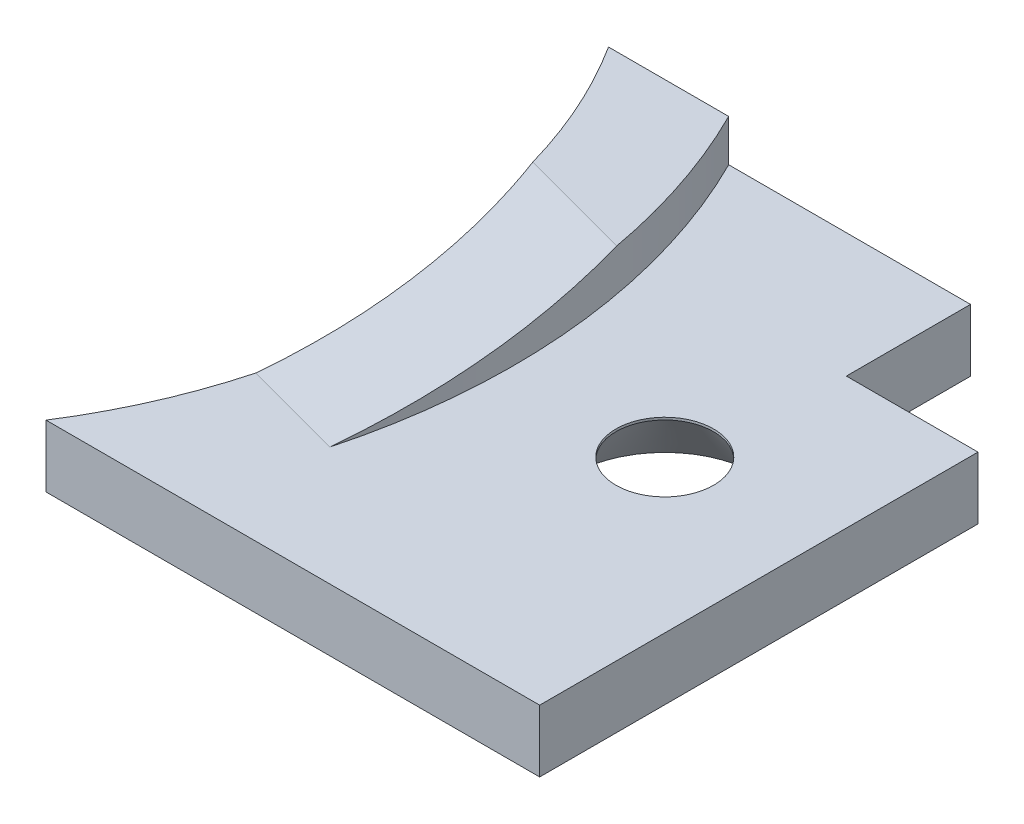
ISO-10303-21;
HEADER;
FILE_DESCRIPTION(('STEP AP214'),'2;1');
FILE_NAME('part.step','',(''),(''),'','','');
FILE_SCHEMA(('AUTOMOTIVE_DESIGN { 1 0 10303 214 1 1 1 1 }'));
ENDSEC;
DATA;
#1=APPLICATION_CONTEXT('core data for automotive mechanical design processes');
#2=APPLICATION_PROTOCOL_DEFINITION('international standard','automotive_design',2000,#1);
#3=PRODUCT_CONTEXT('',#1,'mechanical');
#4=PRODUCT('Part','Part','',(#3));
#5=PRODUCT_RELATED_PRODUCT_CATEGORY('part','',(#4));
#6=PRODUCT_DEFINITION_FORMATION('','',#4);
#7=PRODUCT_DEFINITION_CONTEXT('part definition',#1,'design');
#8=PRODUCT_DEFINITION('design','',#6,#7);
#9=PRODUCT_DEFINITION_SHAPE('','',#8);
#10=(LENGTH_UNIT() NAMED_UNIT(*) SI_UNIT(.MILLI.,.METRE.));
#11=(NAMED_UNIT(*) PLANE_ANGLE_UNIT() SI_UNIT($,.RADIAN.));
#12=(NAMED_UNIT(*) SI_UNIT($,.STERADIAN.) SOLID_ANGLE_UNIT());
#13=UNCERTAINTY_MEASURE_WITH_UNIT(LENGTH_MEASURE(1.E-05),#10,'distance_accuracy_value','');
#14=(GEOMETRIC_REPRESENTATION_CONTEXT(3) GLOBAL_UNCERTAINTY_ASSIGNED_CONTEXT((#13)) GLOBAL_UNIT_ASSIGNED_CONTEXT((#10,
#11,#12)) REPRESENTATION_CONTEXT('',''));
#15=CARTESIAN_POINT('',(0.,0.,0.));
#16=DIRECTION('',(0.,0.,1.));
#17=DIRECTION('',(1.,0.,0.));
#18=AXIS2_PLACEMENT_3D('',#15,#16,#17);
#19=CARTESIAN_POINT('',(-31.2610975201711,2.08,-9.4));
#20=DIRECTION('',(0.,-1.,0.));
#21=DIRECTION('',(0.,0.,-1.));
#22=AXIS2_PLACEMENT_3D('',#19,#20,#21);
#23=CYLINDRICAL_SURFACE('',#22,17.5);
#24=CARTESIAN_POINT('',(-31.2610975201711,2.08,-9.4));
#25=DIRECTION('',(0.,1.,0.));
#26=DIRECTION('',(0.,0.,1.));
#27=AXIS2_PLACEMENT_3D('',#24,#25,#26);
#28=CIRCLE('',#27,17.5);
#29=CARTESIAN_POINT('',(-16.5,2.08,0.));
#30=VERTEX_POINT('',#29);
#31=CARTESIAN_POINT('',(-14.3573955601124,2.08,-4.87066671070587));
#32=VERTEX_POINT('',#31);
#33=EDGE_CURVE('E199',#30,#32,#28,.T.);
#34=ORIENTED_EDGE('',*,*,#33,.T.);
#35=CARTESIAN_POINT('',(-31.2610975201711,2.07999999999994,-9.4));
#36=DIRECTION('',(-0.0397823005914427,0.988116468954881,0.148469567049241));
#37=DIRECTION('',(-0.255743360944977,-0.153707006281877,0.95444721674508));
#38=AXIS2_PLACEMENT_3D('',#35,#36,#37);
#39=ELLIPSE('',#38,17.7104628349222,17.5);
#40=CARTESIAN_POINT('',(-14.4347915727247,3.48,-14.2088905334735));
#41=VERTEX_POINT('',#40);
#42=EDGE_CURVE('E114',#32,#41,#39,.T.);
#43=ORIENTED_EDGE('',*,*,#42,.T.);
#44=CARTESIAN_POINT('',(-31.2610975201711,3.48,-9.4));
#45=DIRECTION('',(0.,1.,0.));
#46=DIRECTION('',(0.,0.,1.));
#47=AXIS2_PLACEMENT_3D('',#44,#45,#46);
#48=CIRCLE('',#47,17.5);
#49=CARTESIAN_POINT('',(-16.5,3.48,-18.8));
#50=VERTEX_POINT('',#49);
#51=EDGE_CURVE('E173',#50,#41,#48,.F.);
#52=ORIENTED_EDGE('',*,*,#51,.F.);
#53=DIRECTION('',(0.,-1.,0.));
#54=VECTOR('',#53,1.);
#55=CARTESIAN_POINT('',(-16.5,2.08,-18.8));
#56=LINE('',#55,#54);
#57=CARTESIAN_POINT('',(-16.5,0.,-18.8));
#58=VERTEX_POINT('',#57);
#59=EDGE_CURVE('E187',#50,#58,#56,.T.);
#60=ORIENTED_EDGE('',*,*,#59,.T.);
#61=CARTESIAN_POINT('',(-31.2610975201711,0.,-9.4));
#62=DIRECTION('',(0.,1.,0.));
#63=DIRECTION('',(0.,0.,1.));
#64=AXIS2_PLACEMENT_3D('',#61,#62,#63);
#65=CIRCLE('',#64,17.5);
#66=CARTESIAN_POINT('',(-16.5,0.,0.));
#67=VERTEX_POINT('',#66);
#68=EDGE_CURVE('E183',#67,#58,#65,.T.);
#69=ORIENTED_EDGE('',*,*,#68,.F.);
#70=DIRECTION('',(0.,-1.,0.));
#71=VECTOR('',#70,1.);
#72=CARTESIAN_POINT('',(-16.5,2.08,0.));
#73=LINE('',#72,#71);
#74=EDGE_CURVE('E259',#30,#67,#73,.T.);
#75=ORIENTED_EDGE('',*,*,#74,.F.);
#76=EDGE_LOOP('',(#34,#43,#52,#60,#69,#75));
#77=FACE_BOUND('',#76,.T.);
#78=ADVANCED_FACE('F89',(#77),#23,.F.);
#79=CARTESIAN_POINT('',(0.,2.08,0.));
#80=DIRECTION('',(0.,0.,-1.));
#81=DIRECTION('',(-1.,0.,0.));
#82=AXIS2_PLACEMENT_3D('',#79,#80,#81);
#83=PLANE('',#82);
#84=DIRECTION('',(1.,0.,0.));
#85=VECTOR('',#84,1.);
#86=CARTESIAN_POINT('',(0.,0.,0.));
#87=LINE('',#86,#85);
#88=CARTESIAN_POINT('',(0.,0.,0.));
#89=VERTEX_POINT('',#88);
#90=EDGE_CURVE('E227',#67,#89,#87,.T.);
#91=ORIENTED_EDGE('',*,*,#90,.T.);
#92=DIRECTION('',(0.,-1.,0.));
#93=VECTOR('',#92,1.);
#94=CARTESIAN_POINT('',(0.,2.08,0.));
#95=LINE('',#94,#93);
#96=CARTESIAN_POINT('',(0.,2.08,0.));
#97=VERTEX_POINT('',#96);
#98=EDGE_CURVE('E257',#97,#89,#95,.T.);
#99=ORIENTED_EDGE('',*,*,#98,.F.);
#100=DIRECTION('',(1.,0.,0.));
#101=VECTOR('',#100,1.);
#102=CARTESIAN_POINT('',(0.,2.08,0.));
#103=LINE('',#102,#101);
#104=EDGE_CURVE('E202',#30,#97,#103,.T.);
#105=ORIENTED_EDGE('',*,*,#104,.F.);
#106=ORIENTED_EDGE('',*,*,#74,.T.);
#107=EDGE_LOOP('',(#91,#99,#105,#106));
#108=FACE_BOUND('',#107,.T.);
#109=ADVANCED_FACE('F281',(#108),#83,.F.);
#110=CARTESIAN_POINT('',(0.,2.08,0.));
#111=DIRECTION('',(1.,0.,0.));
#112=DIRECTION('',(0.,0.,-1.));
#113=AXIS2_PLACEMENT_3D('',#110,#111,#112);
#114=PLANE('',#113);
#115=DIRECTION('',(0.,0.,1.));
#116=VECTOR('',#115,1.);
#117=CARTESIAN_POINT('',(0.,0.,0.));
#118=LINE('',#117,#116);
#119=CARTESIAN_POINT('',(0.,0.,-14.65));
#120=VERTEX_POINT('',#119);
#121=EDGE_CURVE('E231',#120,#89,#118,.T.);
#122=ORIENTED_EDGE('',*,*,#121,.F.);
#123=DIRECTION('',(0.,-1.,0.));
#124=VECTOR('',#123,1.);
#125=CARTESIAN_POINT('',(0.,2.08,-14.65));
#126=LINE('',#125,#124);
#127=CARTESIAN_POINT('',(0.,2.08,-14.65));
#128=VERTEX_POINT('',#127);
#129=EDGE_CURVE('E254',#128,#120,#126,.T.);
#130=ORIENTED_EDGE('',*,*,#129,.F.);
#131=DIRECTION('',(0.,0.,1.));
#132=VECTOR('',#131,1.);
#133=CARTESIAN_POINT('',(0.,2.08,0.));
#134=LINE('',#133,#132);
#135=EDGE_CURVE('E206',#128,#97,#134,.T.);
#136=ORIENTED_EDGE('',*,*,#135,.T.);
#137=ORIENTED_EDGE('',*,*,#98,.T.);
#138=EDGE_LOOP('',(#122,#130,#136,#137));
#139=FACE_BOUND('',#138,.T.);
#140=ADVANCED_FACE('F285',(#139),#114,.T.);
#141=CARTESIAN_POINT('',(0.,2.08,-14.65));
#142=DIRECTION('',(0.,0.,-1.));
#143=DIRECTION('',(-1.,0.,0.));
#144=AXIS2_PLACEMENT_3D('',#141,#142,#143);
#145=PLANE('',#144);
#146=DIRECTION('',(1.,0.,0.));
#147=VECTOR('',#146,1.);
#148=CARTESIAN_POINT('',(0.,0.,-14.65));
#149=LINE('',#148,#147);
#150=CARTESIAN_POINT('',(-4.4,0.,-14.65));
#151=VERTEX_POINT('',#150);
#152=EDGE_CURVE('E235',#151,#120,#149,.T.);
#153=ORIENTED_EDGE('',*,*,#152,.F.);
#154=DIRECTION('',(0.,-1.,0.));
#155=VECTOR('',#154,1.);
#156=CARTESIAN_POINT('',(-4.4,2.08,-14.65));
#157=LINE('',#156,#155);
#158=CARTESIAN_POINT('',(-4.4,2.08,-14.65));
#159=VERTEX_POINT('',#158);
#160=EDGE_CURVE('E251',#159,#151,#157,.T.);
#161=ORIENTED_EDGE('',*,*,#160,.F.);
#162=DIRECTION('',(1.,0.,0.));
#163=VECTOR('',#162,1.);
#164=CARTESIAN_POINT('',(0.,2.08,-14.65));
#165=LINE('',#164,#163);
#166=EDGE_CURVE('E210',#159,#128,#165,.T.);
#167=ORIENTED_EDGE('',*,*,#166,.T.);
#168=ORIENTED_EDGE('',*,*,#129,.T.);
#169=EDGE_LOOP('',(#153,#161,#167,#168));
#170=FACE_BOUND('',#169,.T.);
#171=ADVANCED_FACE('F296',(#170),#145,.T.);
#172=CARTESIAN_POINT('',(-4.39999999999999,2.08,0.));
#173=DIRECTION('',(1.,0.,0.));
#174=DIRECTION('',(0.,0.,-1.));
#175=AXIS2_PLACEMENT_3D('',#172,#173,#174);
#176=PLANE('',#175);
#177=DIRECTION('',(0.,0.,1.));
#178=VECTOR('',#177,1.);
#179=CARTESIAN_POINT('',(-4.39999999999999,0.,0.));
#180=LINE('',#179,#178);
#181=CARTESIAN_POINT('',(-4.4,0.,-18.8));
#182=VERTEX_POINT('',#181);
#183=EDGE_CURVE('E239',#182,#151,#180,.T.);
#184=ORIENTED_EDGE('',*,*,#183,.F.);
#185=DIRECTION('',(0.,-1.,0.));
#186=VECTOR('',#185,1.);
#187=CARTESIAN_POINT('',(-4.4,2.08,-18.8));
#188=LINE('',#187,#186);
#189=CARTESIAN_POINT('',(-4.4,2.08,-18.8));
#190=VERTEX_POINT('',#189);
#191=EDGE_CURVE('E248',#190,#182,#188,.T.);
#192=ORIENTED_EDGE('',*,*,#191,.F.);
#193=DIRECTION('',(0.,0.,1.));
#194=VECTOR('',#193,1.);
#195=CARTESIAN_POINT('',(-4.39999999999999,2.08,0.));
#196=LINE('',#195,#194);
#197=EDGE_CURVE('E214',#190,#159,#196,.T.);
#198=ORIENTED_EDGE('',*,*,#197,.T.);
#199=ORIENTED_EDGE('',*,*,#160,.T.);
#200=EDGE_LOOP('',(#184,#192,#198,#199));
#201=FACE_BOUND('',#200,.T.);
#202=ADVANCED_FACE('F300',(#201),#176,.T.);
#203=CARTESIAN_POINT('',(0.,2.08,-18.8));
#204=DIRECTION('',(0.,0.,-1.));
#205=DIRECTION('',(-1.,0.,0.));
#206=AXIS2_PLACEMENT_3D('',#203,#204,#205);
#207=PLANE('',#206);
#208=DIRECTION('',(1.,0.,0.));
#209=VECTOR('',#208,1.);
#210=CARTESIAN_POINT('',(0.,0.,-18.8));
#211=LINE('',#210,#209);
#212=EDGE_CURVE('E203',#58,#182,#211,.T.);
#213=ORIENTED_EDGE('',*,*,#212,.F.);
#214=ORIENTED_EDGE('',*,*,#59,.F.);
#215=DIRECTION('',(-1.,0.,0.));
#216=VECTOR('',#215,1.);
#217=CARTESIAN_POINT('',(0.,3.48,-18.8));
#218=LINE('',#217,#216);
#219=CARTESIAN_POINT('',(-12.4823861692823,3.48,-18.8));
#220=VERTEX_POINT('',#219);
#221=EDGE_CURVE('E169',#220,#50,#218,.T.);
#222=ORIENTED_EDGE('',*,*,#221,.F.);
#223=DIRECTION('',(0.,-1.,0.));
#224=VECTOR('',#223,1.);
#225=CARTESIAN_POINT('',(-12.4823861692823,3.48,-18.8));
#226=LINE('',#225,#224);
#227=CARTESIAN_POINT('',(-12.4823861692823,2.08,-18.8));
#228=VERTEX_POINT('',#227);
#229=EDGE_CURVE('E177',#220,#228,#226,.T.);
#230=ORIENTED_EDGE('',*,*,#229,.T.);
#231=DIRECTION('',(1.,0.,0.));
#232=VECTOR('',#231,1.);
#233=CARTESIAN_POINT('',(0.,2.08,-18.8));
#234=LINE('',#233,#232);
#235=EDGE_CURVE('E218',#228,#190,#234,.T.);
#236=ORIENTED_EDGE('',*,*,#235,.T.);
#237=ORIENTED_EDGE('',*,*,#191,.T.);
#238=EDGE_LOOP('',(#213,#214,#222,#230,#236,#237));
#239=FACE_BOUND('',#238,.T.);
#240=ADVANCED_FACE('F186',(#239),#207,.T.);
#241=CARTESIAN_POINT('',(-5.09,2.08,-9.27100149335224));
#242=DIRECTION('',(0.,-1.,0.));
#243=DIRECTION('',(0.,0.,-1.));
#244=AXIS2_PLACEMENT_3D('',#241,#242,#243);
#245=CYLINDRICAL_SURFACE('',#244,1.63199987089415);
#246=CARTESIAN_POINT('',(-5.09,2.00000000000002,-9.27100149335224));
#247=DIRECTION('',(0.,1.,0.));
#248=DIRECTION('',(0.,0.,1.));
#249=AXIS2_PLACEMENT_3D('',#246,#247,#248);
#250=CIRCLE('',#249,1.63199987089415);
#251=CARTESIAN_POINT('',(-5.09,2.00000000000002,-7.63900162245809));
#252=VERTEX_POINT('',#251);
#253=EDGE_CURVE('E12',#252,#252,#250,.F.);
#254=ORIENTED_EDGE('',*,*,#253,.T.);
#255=EDGE_LOOP('',(#254));
#256=FACE_BOUND('',#255,.T.);
#257=CARTESIAN_POINT('',(-5.09,2.08,-9.27100149335224));
#258=DIRECTION('',(0.,1.,0.));
#259=DIRECTION('',(0.,0.,1.));
#260=AXIS2_PLACEMENT_3D('',#257,#258,#259);
#261=CIRCLE('',#260,1.63199987089415);
#262=CARTESIAN_POINT('',(-5.09,2.08,-7.63900162245809));
#263=VERTEX_POINT('',#262);
#264=EDGE_CURVE('E220',#263,#263,#261,.T.);
#265=ORIENTED_EDGE('',*,*,#264,.T.);
#266=EDGE_LOOP('',(#265));
#267=FACE_BOUND('',#266,.T.);
#268=ADVANCED_FACE('F307',(#256,#267),#245,.F.);
#269=CARTESIAN_POINT('',(0.,2.08,0.));
#270=DIRECTION('',(0.,1.,0.));
#271=DIRECTION('',(0.,0.,1.));
#272=AXIS2_PLACEMENT_3D('',#269,#270,#271);
#273=PLANE('',#272);
#274=CARTESIAN_POINT('',(-31.2610975201711,2.08,-9.4));
#275=DIRECTION('',(0.,1.,0.));
#276=DIRECTION('',(0.,0.,1.));
#277=AXIS2_PLACEMENT_3D('',#274,#275,#276);
#278=CIRCLE('',#277,21.);
#279=CARTESIAN_POINT('',(-10.9766551681006,2.08,-3.96480005284705));
#280=VERTEX_POINT('',#279);
#281=EDGE_CURVE('E180',#280,#228,#278,.T.);
#282=ORIENTED_EDGE('',*,*,#281,.F.);
#283=DIRECTION('',(0.965925826289068,0.,0.258819045102521));
#284=VECTOR('',#283,1.);
#285=CARTESIAN_POINT('',(0.255903541239894,2.08,-0.955045017744081));
#286=LINE('',#285,#284);
#287=EDGE_CURVE('E194',#32,#280,#286,.T.);
#288=ORIENTED_EDGE('',*,*,#287,.F.);
#289=ORIENTED_EDGE('',*,*,#33,.F.);
#290=ORIENTED_EDGE('',*,*,#104,.T.);
#291=ORIENTED_EDGE('',*,*,#135,.F.);
#292=ORIENTED_EDGE('',*,*,#166,.F.);
#293=ORIENTED_EDGE('',*,*,#197,.F.);
#294=ORIENTED_EDGE('',*,*,#235,.F.);
#295=EDGE_LOOP('',(#282,#288,#289,#290,#291,#292,#293,#294));
#296=FACE_BOUND('',#295,.T.);
#297=ORIENTED_EDGE('',*,*,#264,.F.);
#298=EDGE_LOOP('',(#297));
#299=FACE_BOUND('',#298,.T.);
#300=ADVANCED_FACE('F310',(#296,#299),#273,.T.);
#301=CARTESIAN_POINT('',(0.,0.,0.));
#302=DIRECTION('',(0.,1.,0.));
#303=DIRECTION('',(0.,0.,1.));
#304=AXIS2_PLACEMENT_3D('',#301,#302,#303);
#305=PLANE('',#304);
#306=CARTESIAN_POINT('',(-5.09,0.,-9.27100149335224));
#307=DIRECTION('',(0.,1.,0.));
#308=DIRECTION('',(0.,0.,1.));
#309=AXIS2_PLACEMENT_3D('',#306,#307,#308);
#310=CIRCLE('',#309,3.13199987089416);
#311=CARTESIAN_POINT('',(-5.09,0.,-6.13900162245808));
#312=VERTEX_POINT('',#311);
#313=EDGE_CURVE('E99',#312,#312,#310,.T.);
#314=ORIENTED_EDGE('',*,*,#313,.T.);
#315=EDGE_LOOP('',(#314));
#316=FACE_BOUND('',#315,.T.);
#317=ORIENTED_EDGE('',*,*,#68,.T.);
#318=ORIENTED_EDGE('',*,*,#212,.T.);
#319=ORIENTED_EDGE('',*,*,#183,.T.);
#320=ORIENTED_EDGE('',*,*,#152,.T.);
#321=ORIENTED_EDGE('',*,*,#121,.T.);
#322=ORIENTED_EDGE('',*,*,#90,.F.);
#323=EDGE_LOOP('',(#317,#318,#319,#320,#321,#322));
#324=FACE_BOUND('',#323,.T.);
#325=ADVANCED_FACE('F271',(#316,#324),#305,.F.);
#326=CARTESIAN_POINT('',(-31.2610975201711,3.48,-9.4));
#327=DIRECTION('',(0.,-1.,0.));
#328=DIRECTION('',(0.,0.,-1.));
#329=AXIS2_PLACEMENT_3D('',#326,#327,#328);
#330=CYLINDRICAL_SURFACE('',#329,21.);
#331=CARTESIAN_POINT('',(-31.2610975201711,3.48,-9.4));
#332=DIRECTION('',(0.,1.,0.));
#333=DIRECTION('',(0.,0.,1.));
#334=AXIS2_PLACEMENT_3D('',#331,#332,#333);
#335=CIRCLE('',#334,21.);
#336=CARTESIAN_POINT('',(-10.6045721431267,3.48,-13.1825863304787));
#337=VERTEX_POINT('',#336);
#338=EDGE_CURVE('E165',#337,#220,#335,.T.);
#339=ORIENTED_EDGE('',*,*,#338,.F.);
#340=CARTESIAN_POINT('',(-31.2610975201711,2.07999999999994,-9.4));
#341=DIRECTION('',(-0.0397823005914427,0.988116468954881,0.148469567049241));
#342=DIRECTION('',(-0.255743360944977,-0.153707006281877,0.95444721674508));
#343=AXIS2_PLACEMENT_3D('',#340,#341,#342);
#344=ELLIPSE('',#343,21.2525554019067,21.);
#345=EDGE_CURVE('E106',#337,#280,#344,.F.);
#346=ORIENTED_EDGE('',*,*,#345,.T.);
#347=ORIENTED_EDGE('',*,*,#281,.T.);
#348=ORIENTED_EDGE('',*,*,#229,.F.);
#349=EDGE_LOOP('',(#339,#346,#347,#348));
#350=FACE_BOUND('',#349,.T.);
#351=ADVANCED_FACE('F178',(#350),#330,.T.);
#352=CARTESIAN_POINT('',(0.,3.48,0.));
#353=DIRECTION('',(0.,1.,0.));
#354=DIRECTION('',(0.,0.,1.));
#355=AXIS2_PLACEMENT_3D('',#352,#353,#354);
#356=PLANE('',#355);
#357=ORIENTED_EDGE('',*,*,#51,.T.);
#358=DIRECTION('',(0.965925826289068,0.,0.258819045102521));
#359=VECTOR('',#358,1.);
#360=CARTESIAN_POINT('',(-8.64728376217793,3.48,-12.6581324894487));
#361=LINE('',#360,#359);
#362=EDGE_CURVE('E170',#41,#337,#361,.T.);
#363=ORIENTED_EDGE('',*,*,#362,.T.);
#364=ORIENTED_EDGE('',*,*,#338,.T.);
#365=ORIENTED_EDGE('',*,*,#221,.T.);
#366=EDGE_LOOP('',(#357,#363,#364,#365));
#367=FACE_BOUND('',#366,.T.);
#368=ADVANCED_FACE('F167',(#367),#356,.T.);
#369=CARTESIAN_POINT('',(2.58527494716259,3.48,-9.64837745434571));
#370=DIRECTION('',(-0.0397823005914427,0.988116468954881,0.148469567049241));
#371=DIRECTION('',(-0.965925826289068,0.,-0.258819045102521));
#372=AXIS2_PLACEMENT_3D('',#369,#370,#371);
#373=PLANE('',#372);
#374=ORIENTED_EDGE('',*,*,#42,.F.);
#375=ORIENTED_EDGE('',*,*,#287,.T.);
#376=ORIENTED_EDGE('',*,*,#345,.F.);
#377=ORIENTED_EDGE('',*,*,#362,.F.);
#378=EDGE_LOOP('',(#374,#375,#376,#377));
#379=FACE_BOUND('',#378,.T.);
#380=ADVANCED_FACE('F275',(#379),#373,.T.);
#381=CARTESIAN_POINT('',(-5.09,0.,-9.27100149335224));
#382=DIRECTION('',(0.,-1.,0.));
#383=DIRECTION('',(0.,0.,-1.));
#384=AXIS2_PLACEMENT_3D('',#381,#382,#383);
#385=CONICAL_SURFACE('',#384,3.13199987089416,0.643501108793284);
#386=ORIENTED_EDGE('',*,*,#253,.F.);
#387=EDGE_LOOP('',(#386));
#388=FACE_BOUND('',#387,.T.);
#389=ORIENTED_EDGE('',*,*,#313,.F.);
#390=EDGE_LOOP('',(#389));
#391=FACE_BOUND('',#390,.T.);
#392=ADVANCED_FACE('F92',(#388,#391),#385,.F.);
#393=CLOSED_SHELL('',(#78,#109,#140,#171,#202,#240,#268,#300,#325,#351,#368,#380,#392));
#394=MANIFOLD_SOLID_BREP('B2',#393);
#395=ADVANCED_BREP_SHAPE_REPRESENTATION('',(#18,#394),#14);
#396=SHAPE_DEFINITION_REPRESENTATION(#9,#395);
ENDSEC;
END-ISO-10303-21;
